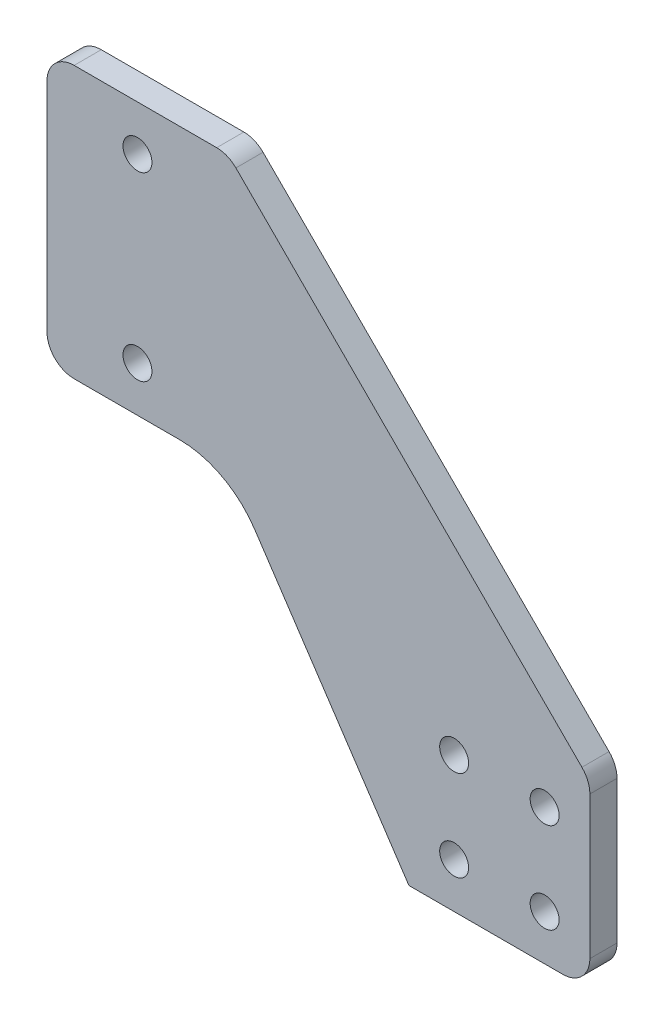
ISO-10303-21;
HEADER;
FILE_DESCRIPTION(('STEP AP214'),'2;1');
FILE_NAME('part.step','',(''),(''),'','','');
FILE_SCHEMA(('AUTOMOTIVE_DESIGN { 1 0 10303 214 1 1 1 1 }'));
ENDSEC;
DATA;
#1=APPLICATION_CONTEXT('core data for automotive mechanical design processes');
#2=APPLICATION_PROTOCOL_DEFINITION('international standard','automotive_design',2000,#1);
#3=PRODUCT_CONTEXT('',#1,'mechanical');
#4=PRODUCT('Part','Part','',(#3));
#5=PRODUCT_RELATED_PRODUCT_CATEGORY('part','',(#4));
#6=PRODUCT_DEFINITION_FORMATION('','',#4);
#7=PRODUCT_DEFINITION_CONTEXT('part definition',#1,'design');
#8=PRODUCT_DEFINITION('design','',#6,#7);
#9=PRODUCT_DEFINITION_SHAPE('','',#8);
#10=(LENGTH_UNIT() NAMED_UNIT(*) SI_UNIT(.MILLI.,.METRE.));
#11=(NAMED_UNIT(*) PLANE_ANGLE_UNIT() SI_UNIT($,.RADIAN.));
#12=(NAMED_UNIT(*) SI_UNIT($,.STERADIAN.) SOLID_ANGLE_UNIT());
#13=UNCERTAINTY_MEASURE_WITH_UNIT(LENGTH_MEASURE(1.E-05),#10,'distance_accuracy_value','');
#14=(GEOMETRIC_REPRESENTATION_CONTEXT(3) GLOBAL_UNCERTAINTY_ASSIGNED_CONTEXT((#13)) GLOBAL_UNIT_ASSIGNED_CONTEXT((#10,
#11,#12)) REPRESENTATION_CONTEXT('',''));
#15=CARTESIAN_POINT('',(0.,0.,0.));
#16=DIRECTION('',(0.,0.,1.));
#17=DIRECTION('',(1.,0.,0.));
#18=AXIS2_PLACEMENT_3D('',#15,#16,#17);
#19=CARTESIAN_POINT('',(0.,0.,3.));
#20=DIRECTION('',(0.,0.,-1.));
#21=DIRECTION('',(-1.,0.,0.));
#22=AXIS2_PLACEMENT_3D('',#19,#20,#21);
#23=PLANE('',#22);
#24=DIRECTION('',(0.,-1.,0.));
#25=VECTOR('',#24,1.);
#26=CARTESIAN_POINT('',(0.,-60.,3.));
#27=LINE('',#26,#25);
#28=CARTESIAN_POINT('',(0.,-3.,3.));
#29=VERTEX_POINT('',#28);
#30=CARTESIAN_POINT('',(0.,-27.,3.));
#31=VERTEX_POINT('',#30);
#32=EDGE_CURVE('E161',#29,#31,#27,.T.);
#33=ORIENTED_EDGE('',*,*,#32,.T.);
#34=CARTESIAN_POINT('',(3.,-27.,3.));
#35=DIRECTION('',(0.,0.,-1.));
#36=DIRECTION('',(-1.,0.,0.));
#37=AXIS2_PLACEMENT_3D('',#34,#35,#36);
#38=CIRCLE('',#37,3.);
#39=CARTESIAN_POINT('',(3.,-30.,3.));
#40=VERTEX_POINT('',#39);
#41=EDGE_CURVE('E218',#31,#40,#38,.F.);
#42=ORIENTED_EDGE('',*,*,#41,.T.);
#43=DIRECTION('',(-1.,0.,0.));
#44=VECTOR('',#43,1.);
#45=CARTESIAN_POINT('',(0.,-30.,3.));
#46=LINE('',#45,#44);
#47=CARTESIAN_POINT('',(14.64816241512,-30.,3.));
#48=VERTEX_POINT('',#47);
#49=EDGE_CURVE('E154',#48,#40,#46,.T.);
#50=ORIENTED_EDGE('',*,*,#49,.F.);
#51=CARTESIAN_POINT('',(14.64816241512,-40.,3.));
#52=DIRECTION('',(0.,0.,-1.));
#53=DIRECTION('',(-1.,0.,0.));
#54=AXIS2_PLACEMENT_3D('',#51,#52,#53);
#55=CIRCLE('',#54,10.);
#56=CARTESIAN_POINT('',(22.9686653584985,-34.4529980377477,3.));
#57=VERTEX_POINT('',#56);
#58=EDGE_CURVE('E52',#48,#57,#55,.T.);
#59=ORIENTED_EDGE('',*,*,#58,.T.);
#60=DIRECTION('',(-0.554700196225229,0.832050294337844,0.));
#61=VECTOR('',#60,1.);
#62=CARTESIAN_POINT('',(20.,-30.,3.));
#63=LINE('',#62,#61);
#64=CARTESIAN_POINT('',(40.,-60.,3.));
#65=VERTEX_POINT('',#64);
#66=EDGE_CURVE('E138',#65,#57,#63,.T.);
#67=ORIENTED_EDGE('',*,*,#66,.F.);
#68=DIRECTION('',(1.,0.,0.));
#69=VECTOR('',#68,1.);
#70=CARTESIAN_POINT('',(60.,-60.,3.));
#71=LINE('',#70,#69);
#72=CARTESIAN_POINT('',(57.,-60.,3.));
#73=VERTEX_POINT('',#72);
#74=EDGE_CURVE('E150',#65,#73,#71,.T.);
#75=ORIENTED_EDGE('',*,*,#74,.T.);
#76=CARTESIAN_POINT('',(57.,-57.,3.));
#77=DIRECTION('',(0.,0.,-1.));
#78=DIRECTION('',(-1.,0.,0.));
#79=AXIS2_PLACEMENT_3D('',#76,#77,#78);
#80=CIRCLE('',#79,3.);
#81=CARTESIAN_POINT('',(60.,-57.,3.));
#82=VERTEX_POINT('',#81);
#83=EDGE_CURVE('E215',#73,#82,#80,.F.);
#84=ORIENTED_EDGE('',*,*,#83,.T.);
#85=DIRECTION('',(0.,1.,0.));
#86=VECTOR('',#85,1.);
#87=CARTESIAN_POINT('',(60.,-40.,3.));
#88=LINE('',#87,#86);
#89=CARTESIAN_POINT('',(60.,-41.2426406871193,3.));
#90=VERTEX_POINT('',#89);
#91=EDGE_CURVE('E160',#82,#90,#88,.T.);
#92=ORIENTED_EDGE('',*,*,#91,.T.);
#93=CARTESIAN_POINT('',(57.,-41.2426406871193,3.));
#94=DIRECTION('',(0.,0.,-1.));
#95=DIRECTION('',(-1.,0.,0.));
#96=AXIS2_PLACEMENT_3D('',#93,#94,#95);
#97=CIRCLE('',#96,3.);
#98=CARTESIAN_POINT('',(59.1213203435596,-39.1213203435596,3.));
#99=VERTEX_POINT('',#98);
#100=EDGE_CURVE('E212',#90,#99,#97,.F.);
#101=ORIENTED_EDGE('',*,*,#100,.T.);
#102=DIRECTION('',(-0.707106781186548,0.707106781186547,0.));
#103=VECTOR('',#102,1.);
#104=CARTESIAN_POINT('',(20.,0.,3.));
#105=LINE('',#104,#103);
#106=CARTESIAN_POINT('',(20.8786796564404,-0.878679656440357,3.));
#107=VERTEX_POINT('',#106);
#108=EDGE_CURVE('E166',#99,#107,#105,.T.);
#109=ORIENTED_EDGE('',*,*,#108,.T.);
#110=CARTESIAN_POINT('',(18.7573593128807,-3.,3.));
#111=DIRECTION('',(0.,0.,-1.));
#112=DIRECTION('',(-1.,0.,0.));
#113=AXIS2_PLACEMENT_3D('',#110,#111,#112);
#114=CIRCLE('',#113,3.);
#115=CARTESIAN_POINT('',(18.7573593128807,0.,3.));
#116=VERTEX_POINT('',#115);
#117=EDGE_CURVE('E209',#107,#116,#114,.F.);
#118=ORIENTED_EDGE('',*,*,#117,.T.);
#119=DIRECTION('',(-1.,0.,0.));
#120=VECTOR('',#119,1.);
#121=CARTESIAN_POINT('',(0.,0.,3.));
#122=LINE('',#121,#120);
#123=CARTESIAN_POINT('',(3.,0.,3.));
#124=VERTEX_POINT('',#123);
#125=EDGE_CURVE('E175',#116,#124,#122,.T.);
#126=ORIENTED_EDGE('',*,*,#125,.T.);
#127=CARTESIAN_POINT('',(3.,-3.,3.));
#128=DIRECTION('',(0.,0.,-1.));
#129=DIRECTION('',(-1.,0.,0.));
#130=AXIS2_PLACEMENT_3D('',#127,#128,#129);
#131=CIRCLE('',#130,3.);
#132=EDGE_CURVE('E206',#124,#29,#131,.F.);
#133=ORIENTED_EDGE('',*,*,#132,.T.);
#134=EDGE_LOOP('',(#33,#42,#50,#59,#67,#75,#84,#92,#101,#109,#118,#126,#133));
#135=FACE_BOUND('',#134,.T.);
#136=CARTESIAN_POINT('',(10.,-4.99999999999999,3.));
#137=DIRECTION('',(0.,0.,1.));
#138=DIRECTION('',(1.,0.,0.));
#139=AXIS2_PLACEMENT_3D('',#136,#137,#138);
#140=CIRCLE('',#139,1.6);
#141=CARTESIAN_POINT('',(11.6,-4.99999999999999,3.));
#142=VERTEX_POINT('',#141);
#143=EDGE_CURVE('E185',#142,#142,#140,.T.);
#144=ORIENTED_EDGE('',*,*,#143,.F.);
#145=EDGE_LOOP('',(#144));
#146=FACE_BOUND('',#145,.T.);
#147=CARTESIAN_POINT('',(55.,-55.,3.));
#148=DIRECTION('',(0.,0.,1.));
#149=DIRECTION('',(1.,0.,0.));
#150=AXIS2_PLACEMENT_3D('',#147,#148,#149);
#151=CIRCLE('',#150,1.6);
#152=CARTESIAN_POINT('',(56.6,-55.,3.));
#153=VERTEX_POINT('',#152);
#154=EDGE_CURVE('E314',#153,#153,#151,.T.);
#155=ORIENTED_EDGE('',*,*,#154,.F.);
#156=EDGE_LOOP('',(#155));
#157=FACE_BOUND('',#156,.T.);
#158=CARTESIAN_POINT('',(10.,-25.,3.));
#159=DIRECTION('',(0.,0.,1.));
#160=DIRECTION('',(1.,0.,0.));
#161=AXIS2_PLACEMENT_3D('',#158,#159,#160);
#162=CIRCLE('',#161,1.6);
#163=CARTESIAN_POINT('',(11.6,-25.,3.));
#164=VERTEX_POINT('',#163);
#165=EDGE_CURVE('E306',#164,#164,#162,.T.);
#166=ORIENTED_EDGE('',*,*,#165,.F.);
#167=EDGE_LOOP('',(#166));
#168=FACE_BOUND('',#167,.T.);
#169=CARTESIAN_POINT('',(55.,-45.,3.));
#170=DIRECTION('',(0.,0.,1.));
#171=DIRECTION('',(-1.,0.,0.));
#172=AXIS2_PLACEMENT_3D('',#169,#170,#171);
#173=CIRCLE('',#172,1.6);
#174=CARTESIAN_POINT('',(53.4,-45.,3.));
#175=VERTEX_POINT('',#174);
#176=EDGE_CURVE('E298',#175,#175,#173,.T.);
#177=ORIENTED_EDGE('',*,*,#176,.F.);
#178=EDGE_LOOP('',(#177));
#179=FACE_BOUND('',#178,.T.);
#180=CARTESIAN_POINT('',(45.,-55.,3.));
#181=DIRECTION('',(0.,0.,1.));
#182=DIRECTION('',(-1.,0.,0.));
#183=AXIS2_PLACEMENT_3D('',#180,#181,#182);
#184=CIRCLE('',#183,1.6);
#185=CARTESIAN_POINT('',(43.4,-55.,3.));
#186=VERTEX_POINT('',#185);
#187=EDGE_CURVE('E290',#186,#186,#184,.T.);
#188=ORIENTED_EDGE('',*,*,#187,.F.);
#189=EDGE_LOOP('',(#188));
#190=FACE_BOUND('',#189,.T.);
#191=CARTESIAN_POINT('',(45.,-45.,3.));
#192=DIRECTION('',(0.,0.,1.));
#193=DIRECTION('',(1.,0.,0.));
#194=AXIS2_PLACEMENT_3D('',#191,#192,#193);
#195=CIRCLE('',#194,1.6);
#196=CARTESIAN_POINT('',(46.6,-45.,3.));
#197=VERTEX_POINT('',#196);
#198=EDGE_CURVE('E282',#197,#197,#195,.T.);
#199=ORIENTED_EDGE('',*,*,#198,.F.);
#200=EDGE_LOOP('',(#199));
#201=FACE_BOUND('',#200,.T.);
#202=ADVANCED_FACE('F43',(#135,#146,#157,#168,#179,#190,#201),#23,.F.);
#203=CARTESIAN_POINT('',(0.,0.,0.));
#204=DIRECTION('',(0.,0.,-1.));
#205=DIRECTION('',(-1.,0.,0.));
#206=AXIS2_PLACEMENT_3D('',#203,#204,#205);
#207=PLANE('',#206);
#208=DIRECTION('',(-0.554700196225229,0.832050294337844,0.));
#209=VECTOR('',#208,1.);
#210=CARTESIAN_POINT('',(20.,-30.,0.));
#211=LINE('',#210,#209);
#212=CARTESIAN_POINT('',(40.,-60.,0.));
#213=VERTEX_POINT('',#212);
#214=CARTESIAN_POINT('',(22.9686653584985,-34.4529980377477,0.));
#215=VERTEX_POINT('',#214);
#216=EDGE_CURVE('E139',#213,#215,#211,.T.);
#217=ORIENTED_EDGE('',*,*,#216,.T.);
#218=CARTESIAN_POINT('',(14.64816241512,-40.,0.));
#219=DIRECTION('',(0.,0.,-1.));
#220=DIRECTION('',(-1.,0.,0.));
#221=AXIS2_PLACEMENT_3D('',#218,#219,#220);
#222=CIRCLE('',#221,10.);
#223=CARTESIAN_POINT('',(14.64816241512,-30.,0.));
#224=VERTEX_POINT('',#223);
#225=EDGE_CURVE('E11',#215,#224,#222,.F.);
#226=ORIENTED_EDGE('',*,*,#225,.T.);
#227=DIRECTION('',(-1.,0.,0.));
#228=VECTOR('',#227,1.);
#229=CARTESIAN_POINT('',(0.,-30.,0.));
#230=LINE('',#229,#228);
#231=CARTESIAN_POINT('',(3.,-30.,0.));
#232=VERTEX_POINT('',#231);
#233=EDGE_CURVE('E153',#224,#232,#230,.T.);
#234=ORIENTED_EDGE('',*,*,#233,.T.);
#235=CARTESIAN_POINT('',(3.,-27.,0.));
#236=DIRECTION('',(0.,0.,-1.));
#237=DIRECTION('',(-1.,0.,0.));
#238=AXIS2_PLACEMENT_3D('',#235,#236,#237);
#239=CIRCLE('',#238,3.);
#240=CARTESIAN_POINT('',(0.,-27.,0.));
#241=VERTEX_POINT('',#240);
#242=EDGE_CURVE('E238',#232,#241,#239,.T.);
#243=ORIENTED_EDGE('',*,*,#242,.T.);
#244=DIRECTION('',(0.,-1.,0.));
#245=VECTOR('',#244,1.);
#246=CARTESIAN_POINT('',(0.,-60.,0.));
#247=LINE('',#246,#245);
#248=CARTESIAN_POINT('',(0.,-3.,0.));
#249=VERTEX_POINT('',#248);
#250=EDGE_CURVE('E180',#249,#241,#247,.T.);
#251=ORIENTED_EDGE('',*,*,#250,.F.);
#252=CARTESIAN_POINT('',(3.,-3.,0.));
#253=DIRECTION('',(0.,0.,-1.));
#254=DIRECTION('',(-1.,0.,0.));
#255=AXIS2_PLACEMENT_3D('',#252,#253,#254);
#256=CIRCLE('',#255,3.);
#257=CARTESIAN_POINT('',(3.,0.,0.));
#258=VERTEX_POINT('',#257);
#259=EDGE_CURVE('E226',#249,#258,#256,.T.);
#260=ORIENTED_EDGE('',*,*,#259,.T.);
#261=DIRECTION('',(-1.,0.,0.));
#262=VECTOR('',#261,1.);
#263=CARTESIAN_POINT('',(0.,0.,0.));
#264=LINE('',#263,#262);
#265=CARTESIAN_POINT('',(18.7573593128807,0.,0.));
#266=VERTEX_POINT('',#265);
#267=EDGE_CURVE('E168',#266,#258,#264,.T.);
#268=ORIENTED_EDGE('',*,*,#267,.F.);
#269=CARTESIAN_POINT('',(18.7573593128807,-3.,0.));
#270=DIRECTION('',(0.,0.,-1.));
#271=DIRECTION('',(-1.,0.,0.));
#272=AXIS2_PLACEMENT_3D('',#269,#270,#271);
#273=CIRCLE('',#272,3.);
#274=CARTESIAN_POINT('',(20.8786796564404,-0.878679656440357,0.));
#275=VERTEX_POINT('',#274);
#276=EDGE_CURVE('E229',#266,#275,#273,.T.);
#277=ORIENTED_EDGE('',*,*,#276,.T.);
#278=DIRECTION('',(-0.707106781186548,0.707106781186547,0.));
#279=VECTOR('',#278,1.);
#280=CARTESIAN_POINT('',(20.,0.,0.));
#281=LINE('',#280,#279);
#282=CARTESIAN_POINT('',(59.1213203435596,-39.1213203435596,0.));
#283=VERTEX_POINT('',#282);
#284=EDGE_CURVE('E192',#283,#275,#281,.T.);
#285=ORIENTED_EDGE('',*,*,#284,.F.);
#286=CARTESIAN_POINT('',(57.,-41.2426406871193,0.));
#287=DIRECTION('',(0.,0.,-1.));
#288=DIRECTION('',(-1.,0.,0.));
#289=AXIS2_PLACEMENT_3D('',#286,#287,#288);
#290=CIRCLE('',#289,3.);
#291=CARTESIAN_POINT('',(60.,-41.2426406871193,0.));
#292=VERTEX_POINT('',#291);
#293=EDGE_CURVE('E232',#283,#292,#290,.T.);
#294=ORIENTED_EDGE('',*,*,#293,.T.);
#295=DIRECTION('',(0.,1.,0.));
#296=VECTOR('',#295,1.);
#297=CARTESIAN_POINT('',(60.,-40.,0.));
#298=LINE('',#297,#296);
#299=CARTESIAN_POINT('',(60.,-57.,0.));
#300=VERTEX_POINT('',#299);
#301=EDGE_CURVE('E188',#300,#292,#298,.T.);
#302=ORIENTED_EDGE('',*,*,#301,.F.);
#303=CARTESIAN_POINT('',(57.,-57.,0.));
#304=DIRECTION('',(0.,0.,-1.));
#305=DIRECTION('',(-1.,0.,0.));
#306=AXIS2_PLACEMENT_3D('',#303,#304,#305);
#307=CIRCLE('',#306,3.);
#308=CARTESIAN_POINT('',(57.,-60.,0.));
#309=VERTEX_POINT('',#308);
#310=EDGE_CURVE('E235',#300,#309,#307,.T.);
#311=ORIENTED_EDGE('',*,*,#310,.T.);
#312=DIRECTION('',(1.,0.,0.));
#313=VECTOR('',#312,1.);
#314=CARTESIAN_POINT('',(60.,-60.,0.));
#315=LINE('',#314,#313);
#316=EDGE_CURVE('E184',#213,#309,#315,.T.);
#317=ORIENTED_EDGE('',*,*,#316,.F.);
#318=EDGE_LOOP('',(#217,#226,#234,#243,#251,#260,#268,#277,#285,#294,#302,#311,#317));
#319=FACE_BOUND('',#318,.T.);
#320=CARTESIAN_POINT('',(45.,-55.,0.));
#321=DIRECTION('',(0.,0.,1.));
#322=DIRECTION('',(-1.,0.,0.));
#323=AXIS2_PLACEMENT_3D('',#320,#321,#322);
#324=CIRCLE('',#323,1.6);
#325=CARTESIAN_POINT('',(43.4,-55.,0.));
#326=VERTEX_POINT('',#325);
#327=EDGE_CURVE('E286',#326,#326,#324,.T.);
#328=ORIENTED_EDGE('',*,*,#327,.T.);
#329=EDGE_LOOP('',(#328));
#330=FACE_BOUND('',#329,.T.);
#331=CARTESIAN_POINT('',(10.,-25.,0.));
#332=DIRECTION('',(0.,0.,1.));
#333=DIRECTION('',(1.,0.,0.));
#334=AXIS2_PLACEMENT_3D('',#331,#332,#333);
#335=CIRCLE('',#334,1.6);
#336=CARTESIAN_POINT('',(11.6,-25.,0.));
#337=VERTEX_POINT('',#336);
#338=EDGE_CURVE('E302',#337,#337,#335,.T.);
#339=ORIENTED_EDGE('',*,*,#338,.T.);
#340=EDGE_LOOP('',(#339));
#341=FACE_BOUND('',#340,.T.);
#342=CARTESIAN_POINT('',(10.,-4.99999999999999,0.));
#343=DIRECTION('',(0.,0.,1.));
#344=DIRECTION('',(1.,0.,0.));
#345=AXIS2_PLACEMENT_3D('',#342,#343,#344);
#346=CIRCLE('',#345,1.6);
#347=CARTESIAN_POINT('',(11.6,-4.99999999999999,0.));
#348=VERTEX_POINT('',#347);
#349=EDGE_CURVE('E318',#348,#348,#346,.T.);
#350=ORIENTED_EDGE('',*,*,#349,.T.);
#351=EDGE_LOOP('',(#350));
#352=FACE_BOUND('',#351,.T.);
#353=CARTESIAN_POINT('',(55.,-55.,0.));
#354=DIRECTION('',(0.,0.,1.));
#355=DIRECTION('',(1.,0.,0.));
#356=AXIS2_PLACEMENT_3D('',#353,#354,#355);
#357=CIRCLE('',#356,1.6);
#358=CARTESIAN_POINT('',(56.6,-55.,0.));
#359=VERTEX_POINT('',#358);
#360=EDGE_CURVE('E310',#359,#359,#357,.T.);
#361=ORIENTED_EDGE('',*,*,#360,.T.);
#362=EDGE_LOOP('',(#361));
#363=FACE_BOUND('',#362,.T.);
#364=CARTESIAN_POINT('',(55.,-45.,0.));
#365=DIRECTION('',(0.,0.,1.));
#366=DIRECTION('',(-1.,0.,0.));
#367=AXIS2_PLACEMENT_3D('',#364,#365,#366);
#368=CIRCLE('',#367,1.6);
#369=CARTESIAN_POINT('',(53.4,-45.,0.));
#370=VERTEX_POINT('',#369);
#371=EDGE_CURVE('E294',#370,#370,#368,.T.);
#372=ORIENTED_EDGE('',*,*,#371,.T.);
#373=EDGE_LOOP('',(#372));
#374=FACE_BOUND('',#373,.T.);
#375=CARTESIAN_POINT('',(45.,-45.,0.));
#376=DIRECTION('',(0.,0.,1.));
#377=DIRECTION('',(1.,0.,0.));
#378=AXIS2_PLACEMENT_3D('',#375,#376,#377);
#379=CIRCLE('',#378,1.6);
#380=CARTESIAN_POINT('',(46.6,-45.,0.));
#381=VERTEX_POINT('',#380);
#382=EDGE_CURVE('E145',#381,#381,#379,.T.);
#383=ORIENTED_EDGE('',*,*,#382,.T.);
#384=EDGE_LOOP('',(#383));
#385=FACE_BOUND('',#384,.T.);
#386=ADVANCED_FACE('F328',(#319,#330,#341,#352,#363,#374,#385),#207,.T.);
#387=CARTESIAN_POINT('',(0.,-60.,3.));
#388=DIRECTION('',(1.,0.,0.));
#389=DIRECTION('',(0.,0.,-1.));
#390=AXIS2_PLACEMENT_3D('',#387,#388,#389);
#391=PLANE('',#390);
#392=ORIENTED_EDGE('',*,*,#250,.T.);
#393=DIRECTION('',(0.,0.,1.));
#394=VECTOR('',#393,1.);
#395=CARTESIAN_POINT('',(0.,-27.,3.));
#396=LINE('',#395,#394);
#397=EDGE_CURVE('E202',#241,#31,#396,.T.);
#398=ORIENTED_EDGE('',*,*,#397,.T.);
#399=ORIENTED_EDGE('',*,*,#32,.F.);
#400=DIRECTION('',(0.,0.,-1.));
#401=VECTOR('',#400,1.);
#402=CARTESIAN_POINT('',(0.,-3.,3.));
#403=LINE('',#402,#401);
#404=EDGE_CURVE('E179',#29,#249,#403,.T.);
#405=ORIENTED_EDGE('',*,*,#404,.T.);
#406=EDGE_LOOP('',(#392,#398,#399,#405));
#407=FACE_BOUND('',#406,.T.);
#408=ADVANCED_FACE('F352',(#407),#391,.F.);
#409=CARTESIAN_POINT('',(60.,-60.,3.));
#410=DIRECTION('',(0.,1.,0.));
#411=DIRECTION('',(-1.,0.,0.));
#412=AXIS2_PLACEMENT_3D('',#409,#410,#411);
#413=PLANE('',#412);
#414=ORIENTED_EDGE('',*,*,#316,.T.);
#415=DIRECTION('',(0.,0.,-1.));
#416=VECTOR('',#415,1.);
#417=CARTESIAN_POINT('',(57.,-60.,3.));
#418=LINE('',#417,#416);
#419=EDGE_CURVE('E158',#309,#73,#418,.F.);
#420=ORIENTED_EDGE('',*,*,#419,.T.);
#421=ORIENTED_EDGE('',*,*,#74,.F.);
#422=DIRECTION('',(0.,0.,1.));
#423=VECTOR('',#422,1.);
#424=CARTESIAN_POINT('',(40.,-60.,0.));
#425=LINE('',#424,#423);
#426=EDGE_CURVE('E136',#213,#65,#425,.T.);
#427=ORIENTED_EDGE('',*,*,#426,.F.);
#428=EDGE_LOOP('',(#414,#420,#421,#427));
#429=FACE_BOUND('',#428,.T.);
#430=ADVANCED_FACE('F156',(#429),#413,.F.);
#431=CARTESIAN_POINT('',(60.,-40.,3.));
#432=DIRECTION('',(-1.,0.,0.));
#433=DIRECTION('',(0.,-1.,0.));
#434=AXIS2_PLACEMENT_3D('',#431,#432,#433);
#435=PLANE('',#434);
#436=ORIENTED_EDGE('',*,*,#91,.F.);
#437=DIRECTION('',(0.,0.,-1.));
#438=VECTOR('',#437,1.);
#439=CARTESIAN_POINT('',(60.,-57.,3.));
#440=LINE('',#439,#438);
#441=EDGE_CURVE('E244',#82,#300,#440,.T.);
#442=ORIENTED_EDGE('',*,*,#441,.T.);
#443=ORIENTED_EDGE('',*,*,#301,.T.);
#444=DIRECTION('',(0.,0.,-1.));
#445=VECTOR('',#444,1.);
#446=CARTESIAN_POINT('',(60.,-41.2426406871193,3.));
#447=LINE('',#446,#445);
#448=EDGE_CURVE('E241',#292,#90,#447,.F.);
#449=ORIENTED_EDGE('',*,*,#448,.T.);
#450=EDGE_LOOP('',(#436,#442,#443,#449));
#451=FACE_BOUND('',#450,.T.);
#452=ADVANCED_FACE('F358',(#451),#435,.F.);
#453=CARTESIAN_POINT('',(20.,0.,3.));
#454=DIRECTION('',(-0.707106781186547,-0.707106781186548,0.));
#455=DIRECTION('',(0.707106781186548,-0.707106781186547,0.));
#456=AXIS2_PLACEMENT_3D('',#453,#454,#455);
#457=PLANE('',#456);
#458=ORIENTED_EDGE('',*,*,#108,.F.);
#459=DIRECTION('',(0.,0.,-1.));
#460=VECTOR('',#459,1.);
#461=CARTESIAN_POINT('',(59.1213203435596,-39.1213203435596,3.));
#462=LINE('',#461,#460);
#463=EDGE_CURVE('E253',#99,#283,#462,.T.);
#464=ORIENTED_EDGE('',*,*,#463,.T.);
#465=ORIENTED_EDGE('',*,*,#284,.T.);
#466=DIRECTION('',(0.,0.,-1.));
#467=VECTOR('',#466,1.);
#468=CARTESIAN_POINT('',(20.8786796564404,-0.878679656440357,3.));
#469=LINE('',#468,#467);
#470=EDGE_CURVE('E250',#275,#107,#469,.F.);
#471=ORIENTED_EDGE('',*,*,#470,.T.);
#472=EDGE_LOOP('',(#458,#464,#465,#471));
#473=FACE_BOUND('',#472,.T.);
#474=ADVANCED_FACE('F344',(#473),#457,.F.);
#475=CARTESIAN_POINT('',(0.,0.,3.));
#476=DIRECTION('',(0.,-1.,0.));
#477=DIRECTION('',(0.,0.,-1.));
#478=AXIS2_PLACEMENT_3D('',#475,#476,#477);
#479=PLANE('',#478);
#480=ORIENTED_EDGE('',*,*,#125,.F.);
#481=DIRECTION('',(0.,0.,-1.));
#482=VECTOR('',#481,1.);
#483=CARTESIAN_POINT('',(18.7573593128807,0.,3.));
#484=LINE('',#483,#482);
#485=EDGE_CURVE('E260',#116,#266,#484,.T.);
#486=ORIENTED_EDGE('',*,*,#485,.T.);
#487=ORIENTED_EDGE('',*,*,#267,.T.);
#488=DIRECTION('',(0.,0.,-1.));
#489=VECTOR('',#488,1.);
#490=CARTESIAN_POINT('',(3.,0.,3.));
#491=LINE('',#490,#489);
#492=EDGE_CURVE('E257',#258,#124,#491,.F.);
#493=ORIENTED_EDGE('',*,*,#492,.T.);
#494=EDGE_LOOP('',(#480,#486,#487,#493));
#495=FACE_BOUND('',#494,.T.);
#496=ADVANCED_FACE('F334',(#495),#479,.F.);
#497=CARTESIAN_POINT('',(10.,-4.99999999999999,3.));
#498=DIRECTION('',(0.,0.,-1.));
#499=DIRECTION('',(-1.,0.,0.));
#500=AXIS2_PLACEMENT_3D('',#497,#498,#499);
#501=CYLINDRICAL_SURFACE('',#500,1.6);
#502=ORIENTED_EDGE('',*,*,#143,.T.);
#503=EDGE_LOOP('',(#502));
#504=FACE_BOUND('',#503,.T.);
#505=ORIENTED_EDGE('',*,*,#349,.F.);
#506=EDGE_LOOP('',(#505));
#507=FACE_BOUND('',#506,.T.);
#508=ADVANCED_FACE('F331',(#504,#507),#501,.F.);
#509=CARTESIAN_POINT('',(55.,-55.,3.));
#510=DIRECTION('',(0.,0.,-1.));
#511=DIRECTION('',(-1.,0.,0.));
#512=AXIS2_PLACEMENT_3D('',#509,#510,#511);
#513=CYLINDRICAL_SURFACE('',#512,1.6);
#514=ORIENTED_EDGE('',*,*,#154,.T.);
#515=EDGE_LOOP('',(#514));
#516=FACE_BOUND('',#515,.T.);
#517=ORIENTED_EDGE('',*,*,#360,.F.);
#518=EDGE_LOOP('',(#517));
#519=FACE_BOUND('',#518,.T.);
#520=ADVANCED_FACE('F333',(#516,#519),#513,.F.);
#521=CARTESIAN_POINT('',(10.,-25.,3.));
#522=DIRECTION('',(0.,0.,-1.));
#523=DIRECTION('',(-1.,0.,0.));
#524=AXIS2_PLACEMENT_3D('',#521,#522,#523);
#525=CYLINDRICAL_SURFACE('',#524,1.6);
#526=ORIENTED_EDGE('',*,*,#165,.T.);
#527=EDGE_LOOP('',(#526));
#528=FACE_BOUND('',#527,.T.);
#529=ORIENTED_EDGE('',*,*,#338,.F.);
#530=EDGE_LOOP('',(#529));
#531=FACE_BOUND('',#530,.T.);
#532=ADVANCED_FACE('F341',(#528,#531),#525,.F.);
#533=CARTESIAN_POINT('',(55.,-45.,3.));
#534=DIRECTION('',(0.,0.,-1.));
#535=DIRECTION('',(-1.,0.,0.));
#536=AXIS2_PLACEMENT_3D('',#533,#534,#535);
#537=CYLINDRICAL_SURFACE('',#536,1.6);
#538=ORIENTED_EDGE('',*,*,#176,.T.);
#539=EDGE_LOOP('',(#538));
#540=FACE_BOUND('',#539,.T.);
#541=ORIENTED_EDGE('',*,*,#371,.F.);
#542=EDGE_LOOP('',(#541));
#543=FACE_BOUND('',#542,.T.);
#544=ADVANCED_FACE('F417',(#540,#543),#537,.F.);
#545=CARTESIAN_POINT('',(45.,-55.,3.));
#546=DIRECTION('',(0.,0.,-1.));
#547=DIRECTION('',(-1.,0.,0.));
#548=AXIS2_PLACEMENT_3D('',#545,#546,#547);
#549=CYLINDRICAL_SURFACE('',#548,1.6);
#550=ORIENTED_EDGE('',*,*,#187,.T.);
#551=EDGE_LOOP('',(#550));
#552=FACE_BOUND('',#551,.T.);
#553=ORIENTED_EDGE('',*,*,#327,.F.);
#554=EDGE_LOOP('',(#553));
#555=FACE_BOUND('',#554,.T.);
#556=ADVANCED_FACE('F423',(#552,#555),#549,.F.);
#557=CARTESIAN_POINT('',(45.,-45.,3.));
#558=DIRECTION('',(0.,0.,-1.));
#559=DIRECTION('',(-1.,0.,0.));
#560=AXIS2_PLACEMENT_3D('',#557,#558,#559);
#561=CYLINDRICAL_SURFACE('',#560,1.6);
#562=ORIENTED_EDGE('',*,*,#198,.T.);
#563=EDGE_LOOP('',(#562));
#564=FACE_BOUND('',#563,.T.);
#565=ORIENTED_EDGE('',*,*,#382,.F.);
#566=EDGE_LOOP('',(#565));
#567=FACE_BOUND('',#566,.T.);
#568=ADVANCED_FACE('F429',(#564,#567),#561,.F.);
#569=CARTESIAN_POINT('',(0.,-30.,0.));
#570=DIRECTION('',(0.,1.,0.));
#571=DIRECTION('',(0.,0.,1.));
#572=AXIS2_PLACEMENT_3D('',#569,#570,#571);
#573=PLANE('',#572);
#574=ORIENTED_EDGE('',*,*,#233,.F.);
#575=DIRECTION('',(0.,0.,1.));
#576=VECTOR('',#575,1.);
#577=CARTESIAN_POINT('',(14.64816241512,-30.,3.));
#578=LINE('',#577,#576);
#579=EDGE_CURVE('E264',#224,#48,#578,.T.);
#580=ORIENTED_EDGE('',*,*,#579,.T.);
#581=ORIENTED_EDGE('',*,*,#49,.T.);
#582=DIRECTION('',(0.,0.,1.));
#583=VECTOR('',#582,1.);
#584=CARTESIAN_POINT('',(3.,-30.,0.));
#585=LINE('',#584,#583);
#586=EDGE_CURVE('E222',#40,#232,#585,.F.);
#587=ORIENTED_EDGE('',*,*,#586,.T.);
#588=EDGE_LOOP('',(#574,#580,#581,#587));
#589=FACE_BOUND('',#588,.T.);
#590=ADVANCED_FACE('F273',(#589),#573,.F.);
#591=CARTESIAN_POINT('',(20.,-30.,0.));
#592=DIRECTION('',(0.832050294337843,0.554700196225229,0.));
#593=DIRECTION('',(-0.554700196225229,0.832050294337844,0.));
#594=AXIS2_PLACEMENT_3D('',#591,#592,#593);
#595=PLANE('',#594);
#596=ORIENTED_EDGE('',*,*,#66,.T.);
#597=DIRECTION('',(0.,0.,1.));
#598=VECTOR('',#597,1.);
#599=CARTESIAN_POINT('',(22.9686653584985,-34.4529980377477,0.));
#600=LINE('',#599,#598);
#601=EDGE_CURVE('E59',#57,#215,#600,.F.);
#602=ORIENTED_EDGE('',*,*,#601,.T.);
#603=ORIENTED_EDGE('',*,*,#216,.F.);
#604=ORIENTED_EDGE('',*,*,#426,.T.);
#605=EDGE_LOOP('',(#596,#602,#603,#604));
#606=FACE_BOUND('',#605,.T.);
#607=ADVANCED_FACE('F137',(#606),#595,.F.);
#608=CARTESIAN_POINT('',(3.,-27.,3.));
#609=DIRECTION('',(0.,0.,1.));
#610=DIRECTION('',(1.,0.,0.));
#611=AXIS2_PLACEMENT_3D('',#608,#609,#610);
#612=CYLINDRICAL_SURFACE('',#611,3.);
#613=ORIENTED_EDGE('',*,*,#242,.F.);
#614=ORIENTED_EDGE('',*,*,#586,.F.);
#615=ORIENTED_EDGE('',*,*,#41,.F.);
#616=ORIENTED_EDGE('',*,*,#397,.F.);
#617=EDGE_LOOP('',(#613,#614,#615,#616));
#618=FACE_BOUND('',#617,.T.);
#619=ADVANCED_FACE('F368',(#618),#612,.T.);
#620=CARTESIAN_POINT('',(57.,-57.,3.));
#621=DIRECTION('',(0.,0.,-1.));
#622=DIRECTION('',(-1.,0.,0.));
#623=AXIS2_PLACEMENT_3D('',#620,#621,#622);
#624=CYLINDRICAL_SURFACE('',#623,3.);
#625=ORIENTED_EDGE('',*,*,#83,.F.);
#626=ORIENTED_EDGE('',*,*,#419,.F.);
#627=ORIENTED_EDGE('',*,*,#310,.F.);
#628=ORIENTED_EDGE('',*,*,#441,.F.);
#629=EDGE_LOOP('',(#625,#626,#627,#628));
#630=FACE_BOUND('',#629,.T.);
#631=ADVANCED_FACE('F371',(#630),#624,.T.);
#632=CARTESIAN_POINT('',(57.,-41.2426406871193,3.));
#633=DIRECTION('',(0.,0.,-1.));
#634=DIRECTION('',(-1.,0.,0.));
#635=AXIS2_PLACEMENT_3D('',#632,#633,#634);
#636=CYLINDRICAL_SURFACE('',#635,3.);
#637=ORIENTED_EDGE('',*,*,#100,.F.);
#638=ORIENTED_EDGE('',*,*,#448,.F.);
#639=ORIENTED_EDGE('',*,*,#293,.F.);
#640=ORIENTED_EDGE('',*,*,#463,.F.);
#641=EDGE_LOOP('',(#637,#638,#639,#640));
#642=FACE_BOUND('',#641,.T.);
#643=ADVANCED_FACE('F375',(#642),#636,.T.);
#644=CARTESIAN_POINT('',(18.7573593128807,-3.,3.));
#645=DIRECTION('',(0.,0.,-1.));
#646=DIRECTION('',(-1.,0.,0.));
#647=AXIS2_PLACEMENT_3D('',#644,#645,#646);
#648=CYLINDRICAL_SURFACE('',#647,3.);
#649=ORIENTED_EDGE('',*,*,#117,.F.);
#650=ORIENTED_EDGE('',*,*,#470,.F.);
#651=ORIENTED_EDGE('',*,*,#276,.F.);
#652=ORIENTED_EDGE('',*,*,#485,.F.);
#653=EDGE_LOOP('',(#649,#650,#651,#652));
#654=FACE_BOUND('',#653,.T.);
#655=ADVANCED_FACE('F379',(#654),#648,.T.);
#656=CARTESIAN_POINT('',(3.,-3.,3.));
#657=DIRECTION('',(0.,0.,-1.));
#658=DIRECTION('',(-1.,0.,0.));
#659=AXIS2_PLACEMENT_3D('',#656,#657,#658);
#660=CYLINDRICAL_SURFACE('',#659,3.);
#661=ORIENTED_EDGE('',*,*,#132,.F.);
#662=ORIENTED_EDGE('',*,*,#492,.F.);
#663=ORIENTED_EDGE('',*,*,#259,.F.);
#664=ORIENTED_EDGE('',*,*,#404,.F.);
#665=EDGE_LOOP('',(#661,#662,#663,#664));
#666=FACE_BOUND('',#665,.T.);
#667=ADVANCED_FACE('F382',(#666),#660,.T.);
#668=CARTESIAN_POINT('',(14.64816241512,-40.,0.));
#669=DIRECTION('',(0.,0.,-1.));
#670=DIRECTION('',(-1.,0.,0.));
#671=AXIS2_PLACEMENT_3D('',#668,#669,#670);
#672=CYLINDRICAL_SURFACE('',#671,10.);
#673=ORIENTED_EDGE('',*,*,#225,.F.);
#674=ORIENTED_EDGE('',*,*,#601,.F.);
#675=ORIENTED_EDGE('',*,*,#58,.F.);
#676=ORIENTED_EDGE('',*,*,#579,.F.);
#677=EDGE_LOOP('',(#673,#674,#675,#676));
#678=FACE_BOUND('',#677,.T.);
#679=ADVANCED_FACE('F45',(#678),#672,.F.);
#680=CLOSED_SHELL('',(#202,#386,#408,#430,#452,#474,#496,#508,#520,#532,#544,#556,#568,#590,
#607,#619,#631,#643,#655,#667,#679));
#681=MANIFOLD_SOLID_BREP('B2',#680);
#682=ADVANCED_BREP_SHAPE_REPRESENTATION('',(#18,#681),#14);
#683=SHAPE_DEFINITION_REPRESENTATION(#9,#682);
ENDSEC;
END-ISO-10303-21;
